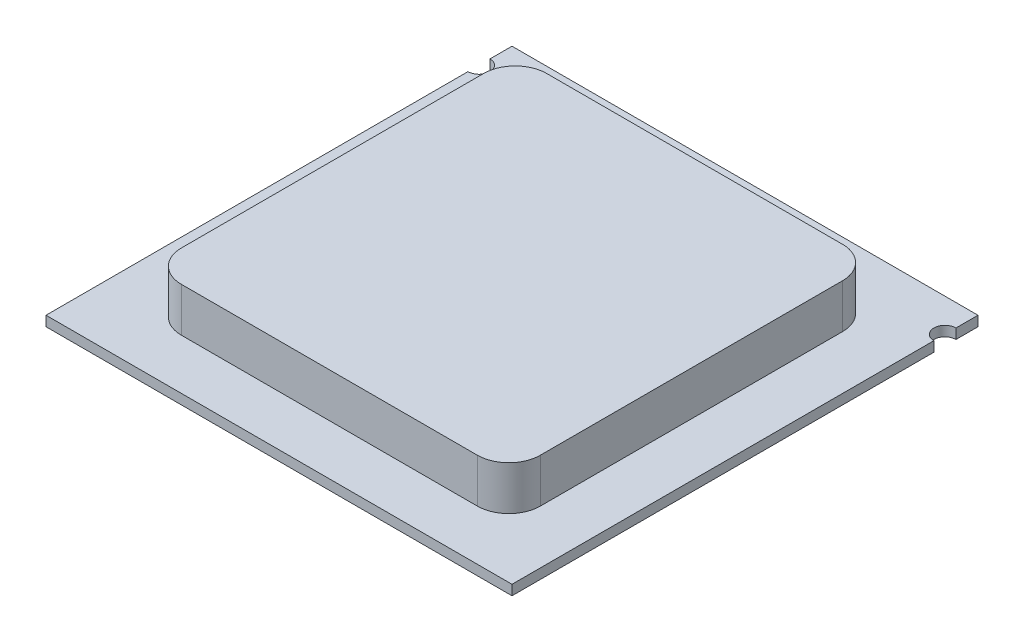
ISO-10303-21;
HEADER;
FILE_DESCRIPTION(('STEP AP214'),'2;1');
FILE_NAME('part.step','',(''),(''),'','','');
FILE_SCHEMA(('AUTOMOTIVE_DESIGN { 1 0 10303 214 1 1 1 1 }'));
ENDSEC;
DATA;
#1=APPLICATION_CONTEXT('core data for automotive mechanical design processes');
#2=APPLICATION_PROTOCOL_DEFINITION('international standard','automotive_design',2000,#1);
#3=PRODUCT_CONTEXT('',#1,'mechanical');
#4=PRODUCT('Part','Part','',(#3));
#5=PRODUCT_RELATED_PRODUCT_CATEGORY('part','',(#4));
#6=PRODUCT_DEFINITION_FORMATION('','',#4);
#7=PRODUCT_DEFINITION_CONTEXT('part definition',#1,'design');
#8=PRODUCT_DEFINITION('design','',#6,#7);
#9=PRODUCT_DEFINITION_SHAPE('','',#8);
#10=(LENGTH_UNIT() NAMED_UNIT(*) SI_UNIT(.MILLI.,.METRE.));
#11=(NAMED_UNIT(*) PLANE_ANGLE_UNIT() SI_UNIT($,.RADIAN.));
#12=(NAMED_UNIT(*) SI_UNIT($,.STERADIAN.) SOLID_ANGLE_UNIT());
#13=UNCERTAINTY_MEASURE_WITH_UNIT(LENGTH_MEASURE(1.E-05),#10,'distance_accuracy_value','');
#14=(GEOMETRIC_REPRESENTATION_CONTEXT(3) GLOBAL_UNCERTAINTY_ASSIGNED_CONTEXT((#13)) GLOBAL_UNIT_ASSIGNED_CONTEXT((#10,
#11,#12)) REPRESENTATION_CONTEXT('',''));
#15=CARTESIAN_POINT('',(0.,0.,0.));
#16=DIRECTION('',(0.,0.,1.));
#17=DIRECTION('',(1.,0.,0.));
#18=AXIS2_PLACEMENT_3D('',#15,#16,#17);
#19=CARTESIAN_POINT('',(-18.5,0.79375,-15.875));
#20=DIRECTION('',(0.,1.,0.));
#21=DIRECTION('',(0.,0.,1.));
#22=AXIS2_PLACEMENT_3D('',#19,#20,#21);
#23=PLANE('',#22);
#24=DIRECTION('',(0.,0.,1.));
#25=VECTOR('',#24,1.);
#26=CARTESIAN_POINT('',(-18.5,0.79375,-18.5));
#27=LINE('',#26,#25);
#28=CARTESIAN_POINT('',(-18.5,0.79375,-18.5));
#29=VERTEX_POINT('',#28);
#30=CARTESIAN_POINT('',(-18.5,0.79375,-16.75));
#31=VERTEX_POINT('',#30);
#32=EDGE_CURVE('E159',#29,#31,#27,.T.);
#33=ORIENTED_EDGE('',*,*,#32,.T.);
#34=CARTESIAN_POINT('',(-18.5,0.79375,-15.875));
#35=DIRECTION('',(0.,-1.,0.));
#36=DIRECTION('',(0.,0.,1.));
#37=AXIS2_PLACEMENT_3D('',#34,#35,#36);
#38=CIRCLE('',#37,0.875000000000001);
#39=CARTESIAN_POINT('',(-18.5,0.79375,-15.));
#40=VERTEX_POINT('',#39);
#41=EDGE_CURVE('E99',#31,#40,#38,.T.);
#42=ORIENTED_EDGE('',*,*,#41,.T.);
#43=DIRECTION('',(0.,0.,1.));
#44=VECTOR('',#43,1.);
#45=CARTESIAN_POINT('',(-18.5,0.79375,-15.));
#46=LINE('',#45,#44);
#47=CARTESIAN_POINT('',(-18.5,0.79375,18.5));
#48=VERTEX_POINT('',#47);
#49=EDGE_CURVE('E174',#40,#48,#46,.T.);
#50=ORIENTED_EDGE('',*,*,#49,.T.);
#51=DIRECTION('',(1.,0.,0.));
#52=VECTOR('',#51,1.);
#53=CARTESIAN_POINT('',(-18.5,0.79375,18.5));
#54=LINE('',#53,#52);
#55=CARTESIAN_POINT('',(18.5,0.79375,18.5));
#56=VERTEX_POINT('',#55);
#57=EDGE_CURVE('E186',#48,#56,#54,.T.);
#58=ORIENTED_EDGE('',*,*,#57,.T.);
#59=DIRECTION('',(0.,0.,-1.));
#60=VECTOR('',#59,1.);
#61=CARTESIAN_POINT('',(18.5,0.79375,-15.));
#62=LINE('',#61,#60);
#63=CARTESIAN_POINT('',(18.5,0.79375,-15.));
#64=VERTEX_POINT('',#63);
#65=EDGE_CURVE('E122',#56,#64,#62,.T.);
#66=ORIENTED_EDGE('',*,*,#65,.T.);
#67=CARTESIAN_POINT('',(18.5,0.79375,-15.875));
#68=DIRECTION('',(0.,-1.,0.));
#69=DIRECTION('',(0.,0.,1.));
#70=AXIS2_PLACEMENT_3D('',#67,#68,#69);
#71=CIRCLE('',#70,0.875000000000001);
#72=CARTESIAN_POINT('',(18.5,0.79375,-16.75));
#73=VERTEX_POINT('',#72);
#74=EDGE_CURVE('E115',#64,#73,#71,.T.);
#75=ORIENTED_EDGE('',*,*,#74,.T.);
#76=DIRECTION('',(0.,0.,-1.));
#77=VECTOR('',#76,1.);
#78=CARTESIAN_POINT('',(18.5,0.79375,-18.5));
#79=LINE('',#78,#77);
#80=CARTESIAN_POINT('',(18.5,0.79375,-18.5));
#81=VERTEX_POINT('',#80);
#82=EDGE_CURVE('E119',#73,#81,#79,.T.);
#83=ORIENTED_EDGE('',*,*,#82,.T.);
#84=DIRECTION('',(-1.,0.,0.));
#85=VECTOR('',#84,1.);
#86=CARTESIAN_POINT('',(-18.5,0.79375,-18.5));
#87=LINE('',#86,#85);
#88=EDGE_CURVE('E58',#81,#29,#87,.T.);
#89=ORIENTED_EDGE('',*,*,#88,.T.);
#90=EDGE_LOOP('',(#33,#42,#50,#58,#66,#75,#83,#89));
#91=FACE_BOUND('',#90,.T.);
#92=DIRECTION('',(-1.,0.,0.));
#93=VECTOR('',#92,1.);
#94=CARTESIAN_POINT('',(-11.75,0.79375,-14.5));
#95=LINE('',#94,#93);
#96=CARTESIAN_POINT('',(11.75,0.79375,-14.5));
#97=VERTEX_POINT('',#96);
#98=CARTESIAN_POINT('',(-11.75,0.79375,-14.5));
#99=VERTEX_POINT('',#98);
#100=EDGE_CURVE('E231',#97,#99,#95,.T.);
#101=ORIENTED_EDGE('',*,*,#100,.F.);
#102=CARTESIAN_POINT('',(11.75,0.79375,-12.));
#103=DIRECTION('',(0.,1.,0.));
#104=DIRECTION('',(0.,0.,1.));
#105=AXIS2_PLACEMENT_3D('',#102,#103,#104);
#106=CIRCLE('',#105,2.5);
#107=CARTESIAN_POINT('',(14.25,0.79375,-12.));
#108=VERTEX_POINT('',#107);
#109=EDGE_CURVE('E234',#108,#97,#106,.T.);
#110=ORIENTED_EDGE('',*,*,#109,.F.);
#111=DIRECTION('',(0.,0.,-1.));
#112=VECTOR('',#111,1.);
#113=CARTESIAN_POINT('',(14.25,0.79375,-12.));
#114=LINE('',#113,#112);
#115=CARTESIAN_POINT('',(14.25,0.79375,12.));
#116=VERTEX_POINT('',#115);
#117=EDGE_CURVE('E214',#116,#108,#114,.T.);
#118=ORIENTED_EDGE('',*,*,#117,.F.);
#119=CARTESIAN_POINT('',(11.75,0.79375,12.));
#120=DIRECTION('',(0.,1.,0.));
#121=DIRECTION('',(0.,0.,1.));
#122=AXIS2_PLACEMENT_3D('',#119,#120,#121);
#123=CIRCLE('',#122,2.5);
#124=CARTESIAN_POINT('',(11.75,0.79375,14.5));
#125=VERTEX_POINT('',#124);
#126=EDGE_CURVE('E217',#125,#116,#123,.T.);
#127=ORIENTED_EDGE('',*,*,#126,.F.);
#128=DIRECTION('',(1.,0.,0.));
#129=VECTOR('',#128,1.);
#130=CARTESIAN_POINT('',(-11.75,0.79375,14.5));
#131=LINE('',#130,#129);
#132=CARTESIAN_POINT('',(-11.75,0.79375,14.5));
#133=VERTEX_POINT('',#132);
#134=EDGE_CURVE('E219',#133,#125,#131,.T.);
#135=ORIENTED_EDGE('',*,*,#134,.F.);
#136=CARTESIAN_POINT('',(-11.75,0.79375,12.));
#137=DIRECTION('',(0.,1.,0.));
#138=DIRECTION('',(0.,0.,1.));
#139=AXIS2_PLACEMENT_3D('',#136,#137,#138);
#140=CIRCLE('',#139,2.5);
#141=CARTESIAN_POINT('',(-14.25,0.79375,12.));
#142=VERTEX_POINT('',#141);
#143=EDGE_CURVE('E222',#142,#133,#140,.T.);
#144=ORIENTED_EDGE('',*,*,#143,.F.);
#145=DIRECTION('',(0.,0.,1.));
#146=VECTOR('',#145,1.);
#147=CARTESIAN_POINT('',(-14.25,0.79375,-12.));
#148=LINE('',#147,#146);
#149=CARTESIAN_POINT('',(-14.25,0.79375,-12.));
#150=VERTEX_POINT('',#149);
#151=EDGE_CURVE('E225',#150,#142,#148,.T.);
#152=ORIENTED_EDGE('',*,*,#151,.F.);
#153=CARTESIAN_POINT('',(-11.75,0.79375,-12.));
#154=DIRECTION('',(0.,1.,0.));
#155=DIRECTION('',(0.,0.,1.));
#156=AXIS2_PLACEMENT_3D('',#153,#154,#155);
#157=CIRCLE('',#156,2.5);
#158=EDGE_CURVE('E228',#99,#150,#157,.T.);
#159=ORIENTED_EDGE('',*,*,#158,.F.);
#160=EDGE_LOOP('',(#101,#110,#118,#127,#135,#144,#152,#159));
#161=FACE_BOUND('',#160,.T.);
#162=ADVANCED_FACE('F34',(#91,#161),#23,.T.);
#163=CARTESIAN_POINT('',(-18.5,0.79375,-18.5));
#164=DIRECTION('',(1.,0.,0.));
#165=DIRECTION('',(0.,0.,-1.));
#166=AXIS2_PLACEMENT_3D('',#163,#164,#165);
#167=PLANE('',#166);
#168=DIRECTION('',(0.,0.,1.));
#169=VECTOR('',#168,1.);
#170=CARTESIAN_POINT('',(-18.5,0.,-18.5));
#171=LINE('',#170,#169);
#172=CARTESIAN_POINT('',(-18.5,0.,-18.5));
#173=VERTEX_POINT('',#172);
#174=CARTESIAN_POINT('',(-18.5,0.,-16.75));
#175=VERTEX_POINT('',#174);
#176=EDGE_CURVE('E143',#173,#175,#171,.T.);
#177=ORIENTED_EDGE('',*,*,#176,.T.);
#178=DIRECTION('',(0.,-1.,0.));
#179=VECTOR('',#178,1.);
#180=CARTESIAN_POINT('',(-18.5,0.79375,-16.75));
#181=LINE('',#180,#179);
#182=EDGE_CURVE('E11',#31,#175,#181,.T.);
#183=ORIENTED_EDGE('',*,*,#182,.F.);
#184=ORIENTED_EDGE('',*,*,#32,.F.);
#185=DIRECTION('',(0.,-1.,0.));
#186=VECTOR('',#185,1.);
#187=CARTESIAN_POINT('',(-18.5,0.79375,-18.5));
#188=LINE('',#187,#186);
#189=EDGE_CURVE('E139',#29,#173,#188,.T.);
#190=ORIENTED_EDGE('',*,*,#189,.T.);
#191=EDGE_LOOP('',(#177,#183,#184,#190));
#192=FACE_BOUND('',#191,.T.);
#193=ADVANCED_FACE('F36',(#192),#167,.F.);
#194=CARTESIAN_POINT('',(-18.5,0.79375,-15.875));
#195=DIRECTION('',(0.,-1.,0.));
#196=DIRECTION('',(0.,0.,-1.));
#197=AXIS2_PLACEMENT_3D('',#194,#195,#196);
#198=CYLINDRICAL_SURFACE('',#197,0.875000000000001);
#199=CARTESIAN_POINT('',(-18.5,0.,-15.875));
#200=DIRECTION('',(0.,-1.,0.));
#201=DIRECTION('',(0.,0.,1.));
#202=AXIS2_PLACEMENT_3D('',#199,#200,#201);
#203=CIRCLE('',#202,0.875000000000001);
#204=CARTESIAN_POINT('',(-18.5,0.,-15.));
#205=VERTEX_POINT('',#204);
#206=EDGE_CURVE('E146',#175,#205,#203,.T.);
#207=ORIENTED_EDGE('',*,*,#206,.T.);
#208=DIRECTION('',(0.,-1.,0.));
#209=VECTOR('',#208,1.);
#210=CARTESIAN_POINT('',(-18.5,0.79375,-15.));
#211=LINE('',#210,#209);
#212=EDGE_CURVE('E42',#40,#205,#211,.T.);
#213=ORIENTED_EDGE('',*,*,#212,.F.);
#214=ORIENTED_EDGE('',*,*,#41,.F.);
#215=ORIENTED_EDGE('',*,*,#182,.T.);
#216=EDGE_LOOP('',(#207,#213,#214,#215));
#217=FACE_BOUND('',#216,.T.);
#218=ADVANCED_FACE('F336',(#217),#198,.F.);
#219=CARTESIAN_POINT('',(-18.5,0.79375,-15.));
#220=DIRECTION('',(1.,0.,0.));
#221=DIRECTION('',(0.,0.,-1.));
#222=AXIS2_PLACEMENT_3D('',#219,#220,#221);
#223=PLANE('',#222);
#224=DIRECTION('',(0.,0.,1.));
#225=VECTOR('',#224,1.);
#226=CARTESIAN_POINT('',(-18.5,0.,-15.));
#227=LINE('',#226,#225);
#228=CARTESIAN_POINT('',(-18.5,0.,18.5));
#229=VERTEX_POINT('',#228);
#230=EDGE_CURVE('E149',#205,#229,#227,.T.);
#231=ORIENTED_EDGE('',*,*,#230,.T.);
#232=DIRECTION('',(0.,-1.,0.));
#233=VECTOR('',#232,1.);
#234=CARTESIAN_POINT('',(-18.5,0.79375,18.5));
#235=LINE('',#234,#233);
#236=EDGE_CURVE('E166',#48,#229,#235,.T.);
#237=ORIENTED_EDGE('',*,*,#236,.F.);
#238=ORIENTED_EDGE('',*,*,#49,.F.);
#239=ORIENTED_EDGE('',*,*,#212,.T.);
#240=EDGE_LOOP('',(#231,#237,#238,#239));
#241=FACE_BOUND('',#240,.T.);
#242=ADVANCED_FACE('F172',(#241),#223,.F.);
#243=CARTESIAN_POINT('',(-18.5,0.79375,18.5));
#244=DIRECTION('',(0.,0.,-1.));
#245=DIRECTION('',(-1.,0.,0.));
#246=AXIS2_PLACEMENT_3D('',#243,#244,#245);
#247=PLANE('',#246);
#248=DIRECTION('',(1.,0.,0.));
#249=VECTOR('',#248,1.);
#250=CARTESIAN_POINT('',(-18.5,0.,18.5));
#251=LINE('',#250,#249);
#252=CARTESIAN_POINT('',(18.5,0.,18.5));
#253=VERTEX_POINT('',#252);
#254=EDGE_CURVE('E151',#229,#253,#251,.T.);
#255=ORIENTED_EDGE('',*,*,#254,.T.);
#256=DIRECTION('',(0.,-1.,0.));
#257=VECTOR('',#256,1.);
#258=CARTESIAN_POINT('',(18.5,0.79375,18.5));
#259=LINE('',#258,#257);
#260=EDGE_CURVE('E163',#56,#253,#259,.T.);
#261=ORIENTED_EDGE('',*,*,#260,.F.);
#262=ORIENTED_EDGE('',*,*,#57,.F.);
#263=ORIENTED_EDGE('',*,*,#236,.T.);
#264=EDGE_LOOP('',(#255,#261,#262,#263));
#265=FACE_BOUND('',#264,.T.);
#266=ADVANCED_FACE('F182',(#265),#247,.F.);
#267=CARTESIAN_POINT('',(18.5,0.79375,-15.));
#268=DIRECTION('',(-1.,0.,0.));
#269=DIRECTION('',(0.,0.,1.));
#270=AXIS2_PLACEMENT_3D('',#267,#268,#269);
#271=PLANE('',#270);
#272=DIRECTION('',(0.,0.,-1.));
#273=VECTOR('',#272,1.);
#274=CARTESIAN_POINT('',(18.5,0.,-15.));
#275=LINE('',#274,#273);
#276=CARTESIAN_POINT('',(18.5,0.,-15.));
#277=VERTEX_POINT('',#276);
#278=EDGE_CURVE('E153',#253,#277,#275,.T.);
#279=ORIENTED_EDGE('',*,*,#278,.T.);
#280=DIRECTION('',(0.,-1.,0.));
#281=VECTOR('',#280,1.);
#282=CARTESIAN_POINT('',(18.5,0.79375,-15.));
#283=LINE('',#282,#281);
#284=EDGE_CURVE('E134',#64,#277,#283,.T.);
#285=ORIENTED_EDGE('',*,*,#284,.F.);
#286=ORIENTED_EDGE('',*,*,#65,.F.);
#287=ORIENTED_EDGE('',*,*,#260,.T.);
#288=EDGE_LOOP('',(#279,#285,#286,#287));
#289=FACE_BOUND('',#288,.T.);
#290=ADVANCED_FACE('F185',(#289),#271,.F.);
#291=CARTESIAN_POINT('',(18.5,0.79375,-15.875));
#292=DIRECTION('',(0.,-1.,0.));
#293=DIRECTION('',(0.,0.,-1.));
#294=AXIS2_PLACEMENT_3D('',#291,#292,#293);
#295=CYLINDRICAL_SURFACE('',#294,0.875000000000001);
#296=CARTESIAN_POINT('',(18.5,0.,-15.875));
#297=DIRECTION('',(0.,-1.,0.));
#298=DIRECTION('',(0.,0.,1.));
#299=AXIS2_PLACEMENT_3D('',#296,#297,#298);
#300=CIRCLE('',#299,0.875000000000001);
#301=CARTESIAN_POINT('',(18.5,0.,-16.75));
#302=VERTEX_POINT('',#301);
#303=EDGE_CURVE('E131',#277,#302,#300,.T.);
#304=ORIENTED_EDGE('',*,*,#303,.T.);
#305=DIRECTION('',(0.,-1.,0.));
#306=VECTOR('',#305,1.);
#307=CARTESIAN_POINT('',(18.5,0.79375,-16.75));
#308=LINE('',#307,#306);
#309=EDGE_CURVE('E128',#73,#302,#308,.T.);
#310=ORIENTED_EDGE('',*,*,#309,.F.);
#311=ORIENTED_EDGE('',*,*,#74,.F.);
#312=ORIENTED_EDGE('',*,*,#284,.T.);
#313=EDGE_LOOP('',(#304,#310,#311,#312));
#314=FACE_BOUND('',#313,.T.);
#315=ADVANCED_FACE('F129',(#314),#295,.F.);
#316=CARTESIAN_POINT('',(18.5,0.79375,-18.5));
#317=DIRECTION('',(-1.,0.,0.));
#318=DIRECTION('',(0.,0.,1.));
#319=AXIS2_PLACEMENT_3D('',#316,#317,#318);
#320=PLANE('',#319);
#321=DIRECTION('',(0.,0.,-1.));
#322=VECTOR('',#321,1.);
#323=CARTESIAN_POINT('',(18.5,0.,-18.5));
#324=LINE('',#323,#322);
#325=CARTESIAN_POINT('',(18.5,0.,-18.5));
#326=VERTEX_POINT('',#325);
#327=EDGE_CURVE('E156',#302,#326,#324,.T.);
#328=ORIENTED_EDGE('',*,*,#327,.T.);
#329=DIRECTION('',(0.,-1.,0.));
#330=VECTOR('',#329,1.);
#331=CARTESIAN_POINT('',(18.5,0.79375,-18.5));
#332=LINE('',#331,#330);
#333=EDGE_CURVE('E135',#81,#326,#332,.T.);
#334=ORIENTED_EDGE('',*,*,#333,.F.);
#335=ORIENTED_EDGE('',*,*,#82,.F.);
#336=ORIENTED_EDGE('',*,*,#309,.T.);
#337=EDGE_LOOP('',(#328,#334,#335,#336));
#338=FACE_BOUND('',#337,.T.);
#339=ADVANCED_FACE('F137',(#338),#320,.F.);
#340=CARTESIAN_POINT('',(-18.5,0.79375,-18.5));
#341=DIRECTION('',(0.,0.,1.));
#342=DIRECTION('',(1.,0.,0.));
#343=AXIS2_PLACEMENT_3D('',#340,#341,#342);
#344=PLANE('',#343);
#345=DIRECTION('',(-1.,0.,0.));
#346=VECTOR('',#345,1.);
#347=CARTESIAN_POINT('',(-18.5,0.,-18.5));
#348=LINE('',#347,#346);
#349=EDGE_CURVE('E91',#326,#173,#348,.T.);
#350=ORIENTED_EDGE('',*,*,#349,.T.);
#351=ORIENTED_EDGE('',*,*,#189,.F.);
#352=ORIENTED_EDGE('',*,*,#88,.F.);
#353=ORIENTED_EDGE('',*,*,#333,.T.);
#354=EDGE_LOOP('',(#350,#351,#352,#353));
#355=FACE_BOUND('',#354,.T.);
#356=ADVANCED_FACE('F343',(#355),#344,.F.);
#357=CARTESIAN_POINT('',(-18.5,0.,-15.875));
#358=DIRECTION('',(0.,1.,0.));
#359=DIRECTION('',(0.,0.,1.));
#360=AXIS2_PLACEMENT_3D('',#357,#358,#359);
#361=PLANE('',#360);
#362=ORIENTED_EDGE('',*,*,#176,.F.);
#363=ORIENTED_EDGE('',*,*,#349,.F.);
#364=ORIENTED_EDGE('',*,*,#327,.F.);
#365=ORIENTED_EDGE('',*,*,#303,.F.);
#366=ORIENTED_EDGE('',*,*,#278,.F.);
#367=ORIENTED_EDGE('',*,*,#254,.F.);
#368=ORIENTED_EDGE('',*,*,#230,.F.);
#369=ORIENTED_EDGE('',*,*,#206,.F.);
#370=EDGE_LOOP('',(#362,#363,#364,#365,#366,#367,#368,#369));
#371=FACE_BOUND('',#370,.T.);
#372=ADVANCED_FACE('F178',(#371),#361,.F.);
#373=CARTESIAN_POINT('',(11.75,4.29375,-12.));
#374=DIRECTION('',(0.,-1.,0.));
#375=DIRECTION('',(0.,0.,-1.));
#376=AXIS2_PLACEMENT_3D('',#373,#374,#375);
#377=CYLINDRICAL_SURFACE('',#376,2.5);
#378=ORIENTED_EDGE('',*,*,#109,.T.);
#379=DIRECTION('',(0.,-1.,0.));
#380=VECTOR('',#379,1.);
#381=CARTESIAN_POINT('',(11.75,4.29375,-14.5));
#382=LINE('',#381,#380);
#383=CARTESIAN_POINT('',(11.75,4.29375,-14.5));
#384=VERTEX_POINT('',#383);
#385=EDGE_CURVE('E147',#384,#97,#382,.T.);
#386=ORIENTED_EDGE('',*,*,#385,.F.);
#387=CARTESIAN_POINT('',(11.75,4.29375,-12.));
#388=DIRECTION('',(0.,1.,0.));
#389=DIRECTION('',(0.,0.,1.));
#390=AXIS2_PLACEMENT_3D('',#387,#388,#389);
#391=CIRCLE('',#390,2.5);
#392=CARTESIAN_POINT('',(14.25,4.29375,-12.));
#393=VERTEX_POINT('',#392);
#394=EDGE_CURVE('E216',#393,#384,#391,.T.);
#395=ORIENTED_EDGE('',*,*,#394,.F.);
#396=DIRECTION('',(0.,-1.,0.));
#397=VECTOR('',#396,1.);
#398=CARTESIAN_POINT('',(14.25,4.29375,-12.));
#399=LINE('',#398,#397);
#400=EDGE_CURVE('E210',#393,#108,#399,.T.);
#401=ORIENTED_EDGE('',*,*,#400,.T.);
#402=EDGE_LOOP('',(#378,#386,#395,#401));
#403=FACE_BOUND('',#402,.T.);
#404=ADVANCED_FACE('F269',(#403),#377,.T.);
#405=CARTESIAN_POINT('',(-11.75,4.29375,-14.5));
#406=DIRECTION('',(0.,0.,1.));
#407=DIRECTION('',(1.,0.,0.));
#408=AXIS2_PLACEMENT_3D('',#405,#406,#407);
#409=PLANE('',#408);
#410=ORIENTED_EDGE('',*,*,#100,.T.);
#411=DIRECTION('',(0.,-1.,0.));
#412=VECTOR('',#411,1.);
#413=CARTESIAN_POINT('',(-11.75,4.29375,-14.5));
#414=LINE('',#413,#412);
#415=CARTESIAN_POINT('',(-11.75,4.29375,-14.5));
#416=VERTEX_POINT('',#415);
#417=EDGE_CURVE('E194',#416,#99,#414,.T.);
#418=ORIENTED_EDGE('',*,*,#417,.F.);
#419=DIRECTION('',(-1.,0.,0.));
#420=VECTOR('',#419,1.);
#421=CARTESIAN_POINT('',(-11.75,4.29375,-14.5));
#422=LINE('',#421,#420);
#423=EDGE_CURVE('E254',#384,#416,#422,.T.);
#424=ORIENTED_EDGE('',*,*,#423,.F.);
#425=ORIENTED_EDGE('',*,*,#385,.T.);
#426=EDGE_LOOP('',(#410,#418,#424,#425));
#427=FACE_BOUND('',#426,.T.);
#428=ADVANCED_FACE('F274',(#427),#409,.F.);
#429=CARTESIAN_POINT('',(-11.75,4.29375,-12.));
#430=DIRECTION('',(0.,-1.,0.));
#431=DIRECTION('',(0.,0.,-1.));
#432=AXIS2_PLACEMENT_3D('',#429,#430,#431);
#433=CYLINDRICAL_SURFACE('',#432,2.5);
#434=ORIENTED_EDGE('',*,*,#158,.T.);
#435=DIRECTION('',(0.,-1.,0.));
#436=VECTOR('',#435,1.);
#437=CARTESIAN_POINT('',(-14.25,4.29375,-12.));
#438=LINE('',#437,#436);
#439=CARTESIAN_POINT('',(-14.25,4.29375,-12.));
#440=VERTEX_POINT('',#439);
#441=EDGE_CURVE('E197',#440,#150,#438,.T.);
#442=ORIENTED_EDGE('',*,*,#441,.F.);
#443=CARTESIAN_POINT('',(-11.75,4.29375,-12.));
#444=DIRECTION('',(0.,1.,0.));
#445=DIRECTION('',(0.,0.,1.));
#446=AXIS2_PLACEMENT_3D('',#443,#444,#445);
#447=CIRCLE('',#446,2.5);
#448=EDGE_CURVE('E251',#416,#440,#447,.T.);
#449=ORIENTED_EDGE('',*,*,#448,.F.);
#450=ORIENTED_EDGE('',*,*,#417,.T.);
#451=EDGE_LOOP('',(#434,#442,#449,#450));
#452=FACE_BOUND('',#451,.T.);
#453=ADVANCED_FACE('F298',(#452),#433,.T.);
#454=CARTESIAN_POINT('',(-14.25,4.29375,-12.));
#455=DIRECTION('',(1.,0.,0.));
#456=DIRECTION('',(0.,0.,-1.));
#457=AXIS2_PLACEMENT_3D('',#454,#455,#456);
#458=PLANE('',#457);
#459=ORIENTED_EDGE('',*,*,#151,.T.);
#460=DIRECTION('',(0.,-1.,0.));
#461=VECTOR('',#460,1.);
#462=CARTESIAN_POINT('',(-14.25,4.29375,12.));
#463=LINE('',#462,#461);
#464=CARTESIAN_POINT('',(-14.25,4.29375,12.));
#465=VERTEX_POINT('',#464);
#466=EDGE_CURVE('E200',#465,#142,#463,.T.);
#467=ORIENTED_EDGE('',*,*,#466,.F.);
#468=DIRECTION('',(0.,0.,1.));
#469=VECTOR('',#468,1.);
#470=CARTESIAN_POINT('',(-14.25,4.29375,-12.));
#471=LINE('',#470,#469);
#472=EDGE_CURVE('E248',#440,#465,#471,.T.);
#473=ORIENTED_EDGE('',*,*,#472,.F.);
#474=ORIENTED_EDGE('',*,*,#441,.T.);
#475=EDGE_LOOP('',(#459,#467,#473,#474));
#476=FACE_BOUND('',#475,.T.);
#477=ADVANCED_FACE('F303',(#476),#458,.F.);
#478=CARTESIAN_POINT('',(-11.75,4.29375,12.));
#479=DIRECTION('',(0.,-1.,0.));
#480=DIRECTION('',(0.,0.,-1.));
#481=AXIS2_PLACEMENT_3D('',#478,#479,#480);
#482=CYLINDRICAL_SURFACE('',#481,2.5);
#483=ORIENTED_EDGE('',*,*,#143,.T.);
#484=DIRECTION('',(0.,-1.,0.));
#485=VECTOR('',#484,1.);
#486=CARTESIAN_POINT('',(-11.75,4.29375,14.5));
#487=LINE('',#486,#485);
#488=CARTESIAN_POINT('',(-11.75,4.29375,14.5));
#489=VERTEX_POINT('',#488);
#490=EDGE_CURVE('E203',#489,#133,#487,.T.);
#491=ORIENTED_EDGE('',*,*,#490,.F.);
#492=CARTESIAN_POINT('',(-11.75,4.29375,12.));
#493=DIRECTION('',(0.,1.,0.));
#494=DIRECTION('',(0.,0.,1.));
#495=AXIS2_PLACEMENT_3D('',#492,#493,#494);
#496=CIRCLE('',#495,2.5);
#497=EDGE_CURVE('E245',#465,#489,#496,.T.);
#498=ORIENTED_EDGE('',*,*,#497,.F.);
#499=ORIENTED_EDGE('',*,*,#466,.T.);
#500=EDGE_LOOP('',(#483,#491,#498,#499));
#501=FACE_BOUND('',#500,.T.);
#502=ADVANCED_FACE('F321',(#501),#482,.T.);
#503=CARTESIAN_POINT('',(-11.75,4.29375,14.5));
#504=DIRECTION('',(0.,0.,-1.));
#505=DIRECTION('',(-1.,0.,0.));
#506=AXIS2_PLACEMENT_3D('',#503,#504,#505);
#507=PLANE('',#506);
#508=ORIENTED_EDGE('',*,*,#134,.T.);
#509=DIRECTION('',(0.,-1.,0.));
#510=VECTOR('',#509,1.);
#511=CARTESIAN_POINT('',(11.75,4.29375,14.5));
#512=LINE('',#511,#510);
#513=CARTESIAN_POINT('',(11.75,4.29375,14.5));
#514=VERTEX_POINT('',#513);
#515=EDGE_CURVE('E206',#514,#125,#512,.T.);
#516=ORIENTED_EDGE('',*,*,#515,.F.);
#517=DIRECTION('',(1.,0.,0.));
#518=VECTOR('',#517,1.);
#519=CARTESIAN_POINT('',(-11.75,4.29375,14.5));
#520=LINE('',#519,#518);
#521=EDGE_CURVE('E242',#489,#514,#520,.T.);
#522=ORIENTED_EDGE('',*,*,#521,.F.);
#523=ORIENTED_EDGE('',*,*,#490,.T.);
#524=EDGE_LOOP('',(#508,#516,#522,#523));
#525=FACE_BOUND('',#524,.T.);
#526=ADVANCED_FACE('F322',(#525),#507,.F.);
#527=CARTESIAN_POINT('',(11.75,4.29375,12.));
#528=DIRECTION('',(0.,-1.,0.));
#529=DIRECTION('',(0.,0.,-1.));
#530=AXIS2_PLACEMENT_3D('',#527,#528,#529);
#531=CYLINDRICAL_SURFACE('',#530,2.5);
#532=ORIENTED_EDGE('',*,*,#126,.T.);
#533=DIRECTION('',(0.,-1.,0.));
#534=VECTOR('',#533,1.);
#535=CARTESIAN_POINT('',(14.25,4.29375,12.));
#536=LINE('',#535,#534);
#537=CARTESIAN_POINT('',(14.25,4.29375,12.));
#538=VERTEX_POINT('',#537);
#539=EDGE_CURVE('E49',#538,#116,#536,.T.);
#540=ORIENTED_EDGE('',*,*,#539,.F.);
#541=CARTESIAN_POINT('',(11.75,4.29375,12.));
#542=DIRECTION('',(0.,1.,0.));
#543=DIRECTION('',(0.,0.,1.));
#544=AXIS2_PLACEMENT_3D('',#541,#542,#543);
#545=CIRCLE('',#544,2.5);
#546=EDGE_CURVE('E239',#514,#538,#545,.T.);
#547=ORIENTED_EDGE('',*,*,#546,.F.);
#548=ORIENTED_EDGE('',*,*,#515,.T.);
#549=EDGE_LOOP('',(#532,#540,#547,#548));
#550=FACE_BOUND('',#549,.T.);
#551=ADVANCED_FACE('F319',(#550),#531,.T.);
#552=CARTESIAN_POINT('',(14.25,4.29375,-12.));
#553=DIRECTION('',(-1.,0.,0.));
#554=DIRECTION('',(0.,0.,1.));
#555=AXIS2_PLACEMENT_3D('',#552,#553,#554);
#556=PLANE('',#555);
#557=ORIENTED_EDGE('',*,*,#117,.T.);
#558=ORIENTED_EDGE('',*,*,#400,.F.);
#559=DIRECTION('',(0.,0.,-1.));
#560=VECTOR('',#559,1.);
#561=CARTESIAN_POINT('',(14.25,4.29375,-12.));
#562=LINE('',#561,#560);
#563=EDGE_CURVE('E213',#538,#393,#562,.T.);
#564=ORIENTED_EDGE('',*,*,#563,.F.);
#565=ORIENTED_EDGE('',*,*,#539,.T.);
#566=EDGE_LOOP('',(#557,#558,#564,#565));
#567=FACE_BOUND('',#566,.T.);
#568=ADVANCED_FACE('F291',(#567),#556,.F.);
#569=CARTESIAN_POINT('',(11.75,4.29375,-12.));
#570=DIRECTION('',(0.,1.,0.));
#571=DIRECTION('',(0.,0.,1.));
#572=AXIS2_PLACEMENT_3D('',#569,#570,#571);
#573=PLANE('',#572);
#574=ORIENTED_EDGE('',*,*,#394,.T.);
#575=ORIENTED_EDGE('',*,*,#423,.T.);
#576=ORIENTED_EDGE('',*,*,#448,.T.);
#577=ORIENTED_EDGE('',*,*,#472,.T.);
#578=ORIENTED_EDGE('',*,*,#497,.T.);
#579=ORIENTED_EDGE('',*,*,#521,.T.);
#580=ORIENTED_EDGE('',*,*,#546,.T.);
#581=ORIENTED_EDGE('',*,*,#563,.T.);
#582=EDGE_LOOP('',(#574,#575,#576,#577,#578,#579,#580,#581));
#583=FACE_BOUND('',#582,.T.);
#584=ADVANCED_FACE('F262',(#583),#573,.T.);
#585=CLOSED_SHELL('',(#162,#193,#218,#242,#266,#290,#315,#339,#356,#372,#404,#428,#453,#477,
#502,#526,#551,#568,#584));
#586=MANIFOLD_SOLID_BREP('B2',#585);
#587=ADVANCED_BREP_SHAPE_REPRESENTATION('',(#18,#586),#14);
#588=SHAPE_DEFINITION_REPRESENTATION(#9,#587);
ENDSEC;
END-ISO-10303-21;
